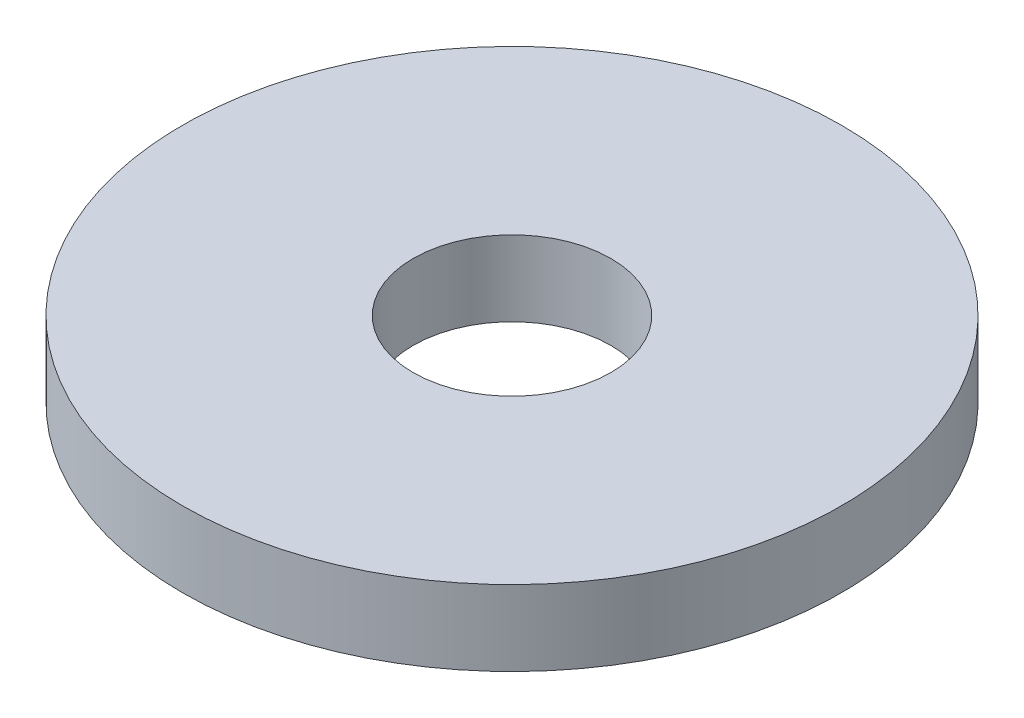
ISO-10303-21;
HEADER;
FILE_DESCRIPTION(('STEP AP214'),'2;1');
FILE_NAME('part.step','',(''),(''),'','','');
FILE_SCHEMA(('AUTOMOTIVE_DESIGN { 1 0 10303 214 1 1 1 1 }'));
ENDSEC;
DATA;
#1=APPLICATION_CONTEXT('core data for automotive mechanical design processes');
#2=APPLICATION_PROTOCOL_DEFINITION('international standard','automotive_design',2000,#1);
#3=PRODUCT_CONTEXT('',#1,'mechanical');
#4=PRODUCT('Part','Part','',(#3));
#5=PRODUCT_RELATED_PRODUCT_CATEGORY('part','',(#4));
#6=PRODUCT_DEFINITION_FORMATION('','',#4);
#7=PRODUCT_DEFINITION_CONTEXT('part definition',#1,'design');
#8=PRODUCT_DEFINITION('design','',#6,#7);
#9=PRODUCT_DEFINITION_SHAPE('','',#8);
#10=(LENGTH_UNIT() NAMED_UNIT(*) SI_UNIT(.MILLI.,.METRE.));
#11=(NAMED_UNIT(*) PLANE_ANGLE_UNIT() SI_UNIT($,.RADIAN.));
#12=(NAMED_UNIT(*) SI_UNIT($,.STERADIAN.) SOLID_ANGLE_UNIT());
#13=UNCERTAINTY_MEASURE_WITH_UNIT(LENGTH_MEASURE(1.E-05),#10,'distance_accuracy_value','');
#14=(GEOMETRIC_REPRESENTATION_CONTEXT(3) GLOBAL_UNCERTAINTY_ASSIGNED_CONTEXT((#13)) GLOBAL_UNIT_ASSIGNED_CONTEXT((#10,
#11,#12)) REPRESENTATION_CONTEXT('',''));
#15=CARTESIAN_POINT('',(0.,0.,0.));
#16=DIRECTION('',(0.,0.,1.));
#17=DIRECTION('',(1.,0.,0.));
#18=AXIS2_PLACEMENT_3D('',#15,#16,#17);
#19=CARTESIAN_POINT('',(0.,1.6,0.));
#20=DIRECTION('',(0.,1.,0.));
#21=DIRECTION('',(0.,0.,1.));
#22=AXIS2_PLACEMENT_3D('',#19,#20,#21);
#23=PLANE('',#22);
#24=CARTESIAN_POINT('',(0.,1.6,0.));
#25=DIRECTION('',(0.,1.,0.));
#26=DIRECTION('',(0.,0.,1.));
#27=AXIS2_PLACEMENT_3D('',#24,#25,#26);
#28=CIRCLE('',#27,7.);
#29=CARTESIAN_POINT('',(0.,1.6,7.));
#30=VERTEX_POINT('',#29);
#31=EDGE_CURVE('E10',#30,#30,#28,.T.);
#32=ORIENTED_EDGE('',*,*,#31,.T.);
#33=EDGE_LOOP('',(#32));
#34=FACE_BOUND('',#33,.T.);
#35=CARTESIAN_POINT('',(0.,1.6,0.));
#36=DIRECTION('',(0.,1.,0.));
#37=DIRECTION('',(0.,0.,1.));
#38=AXIS2_PLACEMENT_3D('',#35,#36,#37);
#39=CIRCLE('',#38,2.1);
#40=CARTESIAN_POINT('',(0.,1.6,2.1));
#41=VERTEX_POINT('',#40);
#42=EDGE_CURVE('E44',#41,#41,#39,.T.);
#43=ORIENTED_EDGE('',*,*,#42,.F.);
#44=EDGE_LOOP('',(#43));
#45=FACE_BOUND('',#44,.T.);
#46=ADVANCED_FACE('F33',(#34,#45),#23,.T.);
#47=CARTESIAN_POINT('',(0.,0.,0.));
#48=DIRECTION('',(0.,1.,0.));
#49=DIRECTION('',(0.,0.,1.));
#50=AXIS2_PLACEMENT_3D('',#47,#48,#49);
#51=PLANE('',#50);
#52=CARTESIAN_POINT('',(0.,0.,0.));
#53=DIRECTION('',(0.,1.,0.));
#54=DIRECTION('',(0.,0.,1.));
#55=AXIS2_PLACEMENT_3D('',#52,#53,#54);
#56=CIRCLE('',#55,7.);
#57=CARTESIAN_POINT('',(0.,0.,7.));
#58=VERTEX_POINT('',#57);
#59=EDGE_CURVE('E37',#58,#58,#56,.T.);
#60=ORIENTED_EDGE('',*,*,#59,.F.);
#61=EDGE_LOOP('',(#60));
#62=FACE_BOUND('',#61,.T.);
#63=CARTESIAN_POINT('',(0.,0.,0.));
#64=DIRECTION('',(0.,1.,0.));
#65=DIRECTION('',(0.,0.,1.));
#66=AXIS2_PLACEMENT_3D('',#63,#64,#65);
#67=CIRCLE('',#66,2.1);
#68=CARTESIAN_POINT('',(0.,0.,2.1));
#69=VERTEX_POINT('',#68);
#70=EDGE_CURVE('E46',#69,#69,#67,.T.);
#71=ORIENTED_EDGE('',*,*,#70,.T.);
#72=EDGE_LOOP('',(#71));
#73=FACE_BOUND('',#72,.T.);
#74=ADVANCED_FACE('F56',(#62,#73),#51,.F.);
#75=CARTESIAN_POINT('',(0.,1.6,0.));
#76=DIRECTION('',(0.,-1.,0.));
#77=DIRECTION('',(0.,0.,-1.));
#78=AXIS2_PLACEMENT_3D('',#75,#76,#77);
#79=CYLINDRICAL_SURFACE('',#78,7.);
#80=ORIENTED_EDGE('',*,*,#31,.F.);
#81=EDGE_LOOP('',(#80));
#82=FACE_BOUND('',#81,.T.);
#83=ORIENTED_EDGE('',*,*,#59,.T.);
#84=EDGE_LOOP('',(#83));
#85=FACE_BOUND('',#84,.T.);
#86=ADVANCED_FACE('F35',(#82,#85),#79,.T.);
#87=CARTESIAN_POINT('',(0.,1.6,0.));
#88=DIRECTION('',(0.,-1.,0.));
#89=DIRECTION('',(0.,0.,-1.));
#90=AXIS2_PLACEMENT_3D('',#87,#88,#89);
#91=CYLINDRICAL_SURFACE('',#90,2.1);
#92=ORIENTED_EDGE('',*,*,#42,.T.);
#93=EDGE_LOOP('',(#92));
#94=FACE_BOUND('',#93,.T.);
#95=ORIENTED_EDGE('',*,*,#70,.F.);
#96=EDGE_LOOP('',(#95));
#97=FACE_BOUND('',#96,.T.);
#98=ADVANCED_FACE('F52',(#94,#97),#91,.F.);
#99=CLOSED_SHELL('',(#46,#74,#86,#98));
#100=MANIFOLD_SOLID_BREP('B2',#99);
#101=ADVANCED_BREP_SHAPE_REPRESENTATION('',(#18,#100),#14);
#102=SHAPE_DEFINITION_REPRESENTATION(#9,#101);
ENDSEC;
END-ISO-10303-21;
